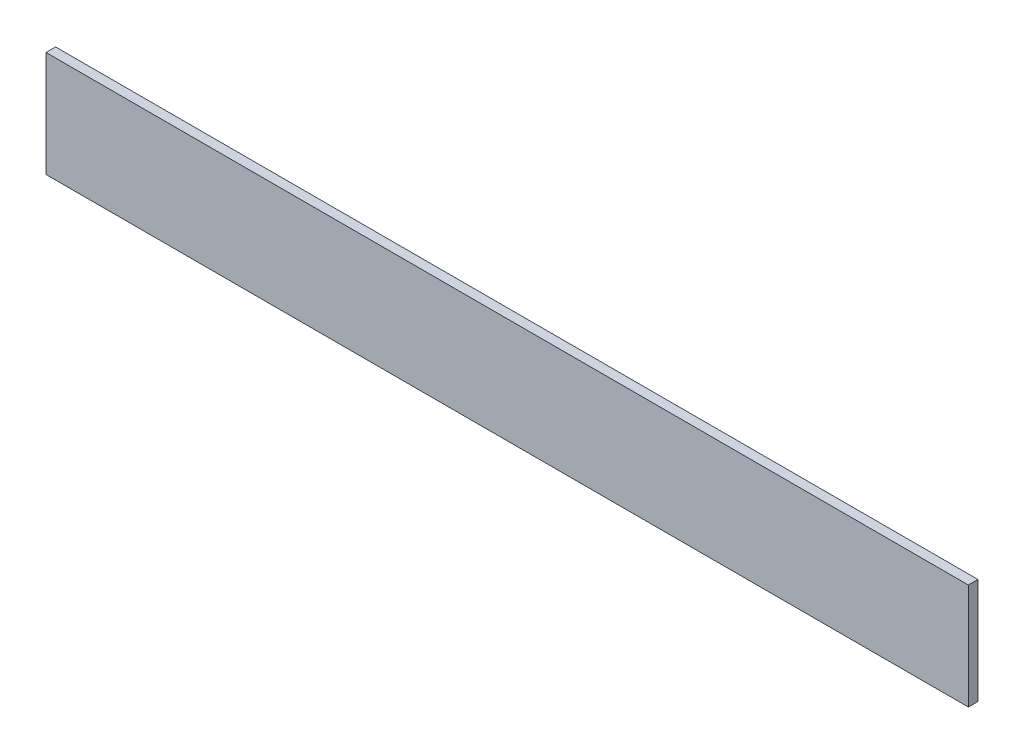
ISO-10303-21;
HEADER;
FILE_DESCRIPTION(('STEP AP214'),'2;1');
FILE_NAME('part.step','',(''),(''),'','','');
FILE_SCHEMA(('AUTOMOTIVE_DESIGN { 1 0 10303 214 1 1 1 1 }'));
ENDSEC;
DATA;
#1=APPLICATION_CONTEXT('core data for automotive mechanical design processes');
#2=APPLICATION_PROTOCOL_DEFINITION('international standard','automotive_design',2000,#1);
#3=PRODUCT_CONTEXT('',#1,'mechanical');
#4=PRODUCT('Part','Part','',(#3));
#5=PRODUCT_RELATED_PRODUCT_CATEGORY('part','',(#4));
#6=PRODUCT_DEFINITION_FORMATION('','',#4);
#7=PRODUCT_DEFINITION_CONTEXT('part definition',#1,'design');
#8=PRODUCT_DEFINITION('design','',#6,#7);
#9=PRODUCT_DEFINITION_SHAPE('','',#8);
#10=(LENGTH_UNIT() NAMED_UNIT(*) SI_UNIT(.MILLI.,.METRE.));
#11=(NAMED_UNIT(*) PLANE_ANGLE_UNIT() SI_UNIT($,.RADIAN.));
#12=(NAMED_UNIT(*) SI_UNIT($,.STERADIAN.) SOLID_ANGLE_UNIT());
#13=UNCERTAINTY_MEASURE_WITH_UNIT(LENGTH_MEASURE(1.E-05),#10,'distance_accuracy_value','');
#14=(GEOMETRIC_REPRESENTATION_CONTEXT(3) GLOBAL_UNCERTAINTY_ASSIGNED_CONTEXT((#13)) GLOBAL_UNIT_ASSIGNED_CONTEXT((#10,
#11,#12)) REPRESENTATION_CONTEXT('',''));
#15=CARTESIAN_POINT('',(0.,0.,0.));
#16=DIRECTION('',(0.,0.,1.));
#17=DIRECTION('',(1.,0.,0.));
#18=AXIS2_PLACEMENT_3D('',#15,#16,#17);
#19=CARTESIAN_POINT('',(-0.47999904,0.05500116,0.01));
#20=DIRECTION('',(0.,0.,1.));
#21=DIRECTION('',(1.,0.,0.));
#22=AXIS2_PLACEMENT_3D('',#19,#20,#21);
#23=PLANE('',#22);
#24=DIRECTION('',(0.,1.,0.));
#25=VECTOR('',#24,1.);
#26=CARTESIAN_POINT('',(0.48000158,0.05500116,0.01));
#27=LINE('',#26,#25);
#28=CARTESIAN_POINT('',(0.48000158,0.05500116,0.01));
#29=VERTEX_POINT('',#28);
#30=CARTESIAN_POINT('',(0.48000158,-0.05499862000001,0.01));
#31=VERTEX_POINT('',#30);
#32=EDGE_CURVE('E53',#29,#31,#27,.F.);
#33=ORIENTED_EDGE('',*,*,#32,.F.);
#34=DIRECTION('',(1.,0.,0.));
#35=VECTOR('',#34,1.);
#36=CARTESIAN_POINT('',(-0.47999904,0.05500116,0.01));
#37=LINE('',#36,#35);
#38=CARTESIAN_POINT('',(-0.47999904,0.05500116,0.01));
#39=VERTEX_POINT('',#38);
#40=EDGE_CURVE('E68',#39,#29,#37,.T.);
#41=ORIENTED_EDGE('',*,*,#40,.F.);
#42=DIRECTION('',(0.,1.,0.));
#43=VECTOR('',#42,1.);
#44=CARTESIAN_POINT('',(-0.47999904,-0.05499862000001,0.01));
#45=LINE('',#44,#43);
#46=CARTESIAN_POINT('',(-0.47999904,-0.05499862000001,0.01));
#47=VERTEX_POINT('',#46);
#48=EDGE_CURVE('E20',#47,#39,#45,.T.);
#49=ORIENTED_EDGE('',*,*,#48,.F.);
#50=DIRECTION('',(1.,0.,0.));
#51=VECTOR('',#50,1.);
#52=CARTESIAN_POINT('',(0.48000158,-0.05499862000001,0.01));
#53=LINE('',#52,#51);
#54=EDGE_CURVE('E58',#31,#47,#53,.F.);
#55=ORIENTED_EDGE('',*,*,#54,.F.);
#56=EDGE_LOOP('',(#33,#41,#49,#55));
#57=FACE_BOUND('',#56,.T.);
#58=ADVANCED_FACE('F17',(#57),#23,.T.);
#59=CARTESIAN_POINT('',(-0.47999904,-0.05499862000001,0.));
#60=DIRECTION('',(-1.,0.,0.));
#61=DIRECTION('',(0.,0.,1.));
#62=AXIS2_PLACEMENT_3D('',#59,#60,#61);
#63=PLANE('',#62);
#64=DIRECTION('',(0.,0.,1.));
#65=VECTOR('',#64,1.);
#66=CARTESIAN_POINT('',(-0.47999904,0.05500116,0.));
#67=LINE('',#66,#65);
#68=CARTESIAN_POINT('',(-0.47999904,0.05500116,0.));
#69=VERTEX_POINT('',#68);
#70=EDGE_CURVE('E79',#69,#39,#67,.T.);
#71=ORIENTED_EDGE('',*,*,#70,.F.);
#72=DIRECTION('',(0.,1.,0.));
#73=VECTOR('',#72,1.);
#74=CARTESIAN_POINT('',(-0.47999904,0.05500116,0.));
#75=LINE('',#74,#73);
#76=CARTESIAN_POINT('',(-0.47999904,-0.05499862000001,0.));
#77=VERTEX_POINT('',#76);
#78=EDGE_CURVE('E74',#69,#77,#75,.F.);
#79=ORIENTED_EDGE('',*,*,#78,.T.);
#80=DIRECTION('',(0.,0.,-1.));
#81=VECTOR('',#80,1.);
#82=CARTESIAN_POINT('',(-0.47999904,-0.05499862000001,0.));
#83=LINE('',#82,#81);
#84=EDGE_CURVE('E63',#47,#77,#83,.T.);
#85=ORIENTED_EDGE('',*,*,#84,.F.);
#86=ORIENTED_EDGE('',*,*,#48,.T.);
#87=EDGE_LOOP('',(#71,#79,#85,#86));
#88=FACE_BOUND('',#87,.T.);
#89=ADVANCED_FACE('F73',(#88),#63,.T.);
#90=CARTESIAN_POINT('',(0.48000158,-0.05499862000001,0.));
#91=DIRECTION('',(0.,-1.,0.));
#92=DIRECTION('',(0.,0.,-1.));
#93=AXIS2_PLACEMENT_3D('',#90,#91,#92);
#94=PLANE('',#93);
#95=ORIENTED_EDGE('',*,*,#84,.T.);
#96=DIRECTION('',(1.,0.,0.));
#97=VECTOR('',#96,1.);
#98=CARTESIAN_POINT('',(-0.47999904,-0.05499862000001,0.));
#99=LINE('',#98,#97);
#100=CARTESIAN_POINT('',(0.48000158,-0.05499862000001,0.));
#101=VERTEX_POINT('',#100);
#102=EDGE_CURVE('E84',#77,#101,#99,.T.);
#103=ORIENTED_EDGE('',*,*,#102,.T.);
#104=DIRECTION('',(0.,0.,-1.));
#105=VECTOR('',#104,1.);
#106=CARTESIAN_POINT('',(0.48000158,-0.05499862000001,0.));
#107=LINE('',#106,#105);
#108=EDGE_CURVE('E65',#31,#101,#107,.T.);
#109=ORIENTED_EDGE('',*,*,#108,.F.);
#110=ORIENTED_EDGE('',*,*,#54,.T.);
#111=EDGE_LOOP('',(#95,#103,#109,#110));
#112=FACE_BOUND('',#111,.T.);
#113=ADVANCED_FACE('F60',(#112),#94,.T.);
#114=CARTESIAN_POINT('',(0.48000158,0.05500116,0.));
#115=DIRECTION('',(1.,0.,0.));
#116=DIRECTION('',(0.,0.,-1.));
#117=AXIS2_PLACEMENT_3D('',#114,#115,#116);
#118=PLANE('',#117);
#119=ORIENTED_EDGE('',*,*,#108,.T.);
#120=DIRECTION('',(0.,1.,0.));
#121=VECTOR('',#120,1.);
#122=CARTESIAN_POINT('',(0.48000158,0.05500116,0.));
#123=LINE('',#122,#121);
#124=CARTESIAN_POINT('',(0.48000158,0.05500116,0.));
#125=VERTEX_POINT('',#124);
#126=EDGE_CURVE('E26',#101,#125,#123,.T.);
#127=ORIENTED_EDGE('',*,*,#126,.T.);
#128=DIRECTION('',(0.,0.,1.));
#129=VECTOR('',#128,1.);
#130=CARTESIAN_POINT('',(0.48000158,0.05500116,0.));
#131=LINE('',#130,#129);
#132=EDGE_CURVE('E34',#29,#125,#131,.F.);
#133=ORIENTED_EDGE('',*,*,#132,.F.);
#134=ORIENTED_EDGE('',*,*,#32,.T.);
#135=EDGE_LOOP('',(#119,#127,#133,#134));
#136=FACE_BOUND('',#135,.T.);
#137=ADVANCED_FACE('F88',(#136),#118,.T.);
#138=CARTESIAN_POINT('',(-0.47999904,0.05500116,0.));
#139=DIRECTION('',(0.,1.,0.));
#140=DIRECTION('',(0.,0.,1.));
#141=AXIS2_PLACEMENT_3D('',#138,#139,#140);
#142=PLANE('',#141);
#143=ORIENTED_EDGE('',*,*,#132,.T.);
#144=DIRECTION('',(1.,0.,0.));
#145=VECTOR('',#144,1.);
#146=CARTESIAN_POINT('',(-0.47999904,0.05500116,0.));
#147=LINE('',#146,#145);
#148=EDGE_CURVE('E11',#125,#69,#147,.F.);
#149=ORIENTED_EDGE('',*,*,#148,.T.);
#150=ORIENTED_EDGE('',*,*,#70,.T.);
#151=ORIENTED_EDGE('',*,*,#40,.T.);
#152=EDGE_LOOP('',(#143,#149,#150,#151));
#153=FACE_BOUND('',#152,.T.);
#154=ADVANCED_FACE('F91',(#153),#142,.T.);
#155=CARTESIAN_POINT('',(-0.47999904,0.05500116,0.));
#156=DIRECTION('',(0.,0.,1.));
#157=DIRECTION('',(1.,0.,0.));
#158=AXIS2_PLACEMENT_3D('',#155,#156,#157);
#159=PLANE('',#158);
#160=ORIENTED_EDGE('',*,*,#126,.F.);
#161=ORIENTED_EDGE('',*,*,#102,.F.);
#162=ORIENTED_EDGE('',*,*,#78,.F.);
#163=ORIENTED_EDGE('',*,*,#148,.F.);
#164=EDGE_LOOP('',(#160,#161,#162,#163));
#165=FACE_BOUND('',#164,.T.);
#166=ADVANCED_FACE('F90',(#165),#159,.F.);
#167=CLOSED_SHELL('',(#58,#89,#113,#137,#154,#166));
#168=MANIFOLD_SOLID_BREP('B1',#167);
#169=ADVANCED_BREP_SHAPE_REPRESENTATION('',(#18,#168),#14);
#170=SHAPE_DEFINITION_REPRESENTATION(#9,#169);
ENDSEC;
END-ISO-10303-21;
